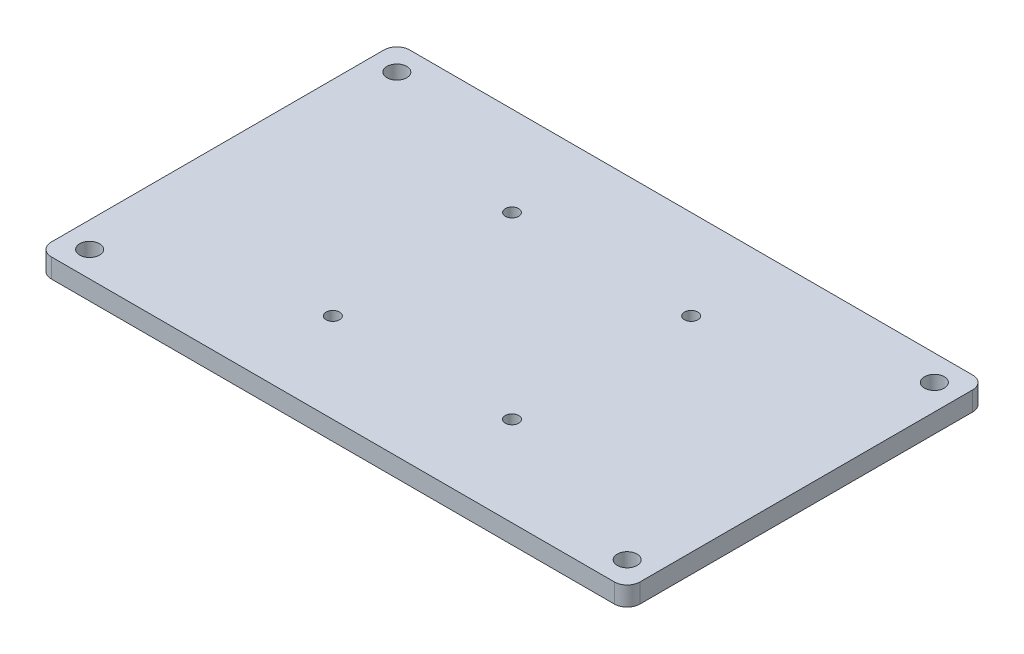
ISO-10303-21;
HEADER;
FILE_DESCRIPTION(('STEP AP214'),'2;1');
FILE_NAME('part.step','',(''),(''),'','','');
FILE_SCHEMA(('AUTOMOTIVE_DESIGN { 1 0 10303 214 1 1 1 1 }'));
ENDSEC;
DATA;
#1=APPLICATION_CONTEXT('core data for automotive mechanical design processes');
#2=APPLICATION_PROTOCOL_DEFINITION('international standard','automotive_design',2000,#1);
#3=PRODUCT_CONTEXT('',#1,'mechanical');
#4=PRODUCT('Part','Part','',(#3));
#5=PRODUCT_RELATED_PRODUCT_CATEGORY('part','',(#4));
#6=PRODUCT_DEFINITION_FORMATION('','',#4);
#7=PRODUCT_DEFINITION_CONTEXT('part definition',#1,'design');
#8=PRODUCT_DEFINITION('design','',#6,#7);
#9=PRODUCT_DEFINITION_SHAPE('','',#8);
#10=(LENGTH_UNIT() NAMED_UNIT(*) SI_UNIT(.MILLI.,.METRE.));
#11=(NAMED_UNIT(*) PLANE_ANGLE_UNIT() SI_UNIT($,.RADIAN.));
#12=(NAMED_UNIT(*) SI_UNIT($,.STERADIAN.) SOLID_ANGLE_UNIT());
#13=UNCERTAINTY_MEASURE_WITH_UNIT(LENGTH_MEASURE(1.E-05),#10,'distance_accuracy_value','');
#14=(GEOMETRIC_REPRESENTATION_CONTEXT(3) GLOBAL_UNCERTAINTY_ASSIGNED_CONTEXT((#13)) GLOBAL_UNIT_ASSIGNED_CONTEXT((#10,
#11,#12)) REPRESENTATION_CONTEXT('',''));
#15=CARTESIAN_POINT('',(0.,0.,0.));
#16=DIRECTION('',(0.,0.,1.));
#17=DIRECTION('',(1.,0.,0.));
#18=AXIS2_PLACEMENT_3D('',#15,#16,#17);
#19=CARTESIAN_POINT('',(44.,3.,26.));
#20=DIRECTION('',(0.,1.,0.));
#21=DIRECTION('',(0.,0.,1.));
#22=AXIS2_PLACEMENT_3D('',#19,#20,#21);
#23=PLANE('',#22);
#24=CARTESIAN_POINT('',(-14.,3.,-14.));
#25=DIRECTION('',(0.,1.,0.));
#26=DIRECTION('',(0.,0.,-1.));
#27=AXIS2_PLACEMENT_3D('',#24,#25,#26);
#28=CIRCLE('',#27,1.05);
#29=CARTESIAN_POINT('',(-14.,3.,-15.05));
#30=VERTEX_POINT('',#29);
#31=EDGE_CURVE('E253',#30,#30,#28,.T.);
#32=ORIENTED_EDGE('',*,*,#31,.F.);
#33=EDGE_LOOP('',(#32));
#34=FACE_BOUND('',#33,.T.);
#35=CARTESIAN_POINT('',(14.,3.,-14.));
#36=DIRECTION('',(0.,1.,0.));
#37=DIRECTION('',(0.,0.,1.));
#38=AXIS2_PLACEMENT_3D('',#35,#36,#37);
#39=CIRCLE('',#38,1.05);
#40=CARTESIAN_POINT('',(14.,3.,-12.95));
#41=VERTEX_POINT('',#40);
#42=EDGE_CURVE('E237',#41,#41,#39,.T.);
#43=ORIENTED_EDGE('',*,*,#42,.F.);
#44=EDGE_LOOP('',(#43));
#45=FACE_BOUND('',#44,.T.);
#46=CARTESIAN_POINT('',(42.,3.,24.));
#47=DIRECTION('',(0.,1.,0.));
#48=DIRECTION('',(0.,0.,-1.));
#49=AXIS2_PLACEMENT_3D('',#46,#47,#48);
#50=CIRCLE('',#49,1.55);
#51=CARTESIAN_POINT('',(42.,3.,22.45));
#52=VERTEX_POINT('',#51);
#53=EDGE_CURVE('E221',#52,#52,#50,.T.);
#54=ORIENTED_EDGE('',*,*,#53,.F.);
#55=EDGE_LOOP('',(#54));
#56=FACE_BOUND('',#55,.T.);
#57=CARTESIAN_POINT('',(42.,3.,-24.));
#58=DIRECTION('',(0.,1.,0.));
#59=DIRECTION('',(0.,0.,1.));
#60=AXIS2_PLACEMENT_3D('',#57,#58,#59);
#61=CIRCLE('',#60,1.55);
#62=CARTESIAN_POINT('',(42.,3.,-22.45));
#63=VERTEX_POINT('',#62);
#64=EDGE_CURVE('E146',#63,#63,#61,.T.);
#65=ORIENTED_EDGE('',*,*,#64,.F.);
#66=EDGE_LOOP('',(#65));
#67=FACE_BOUND('',#66,.T.);
#68=CARTESIAN_POINT('',(44.,3.,26.));
#69=DIRECTION('',(0.,1.,0.));
#70=DIRECTION('',(0.,0.,1.));
#71=AXIS2_PLACEMENT_3D('',#68,#69,#70);
#72=CIRCLE('',#71,2.);
#73=CARTESIAN_POINT('',(44.,3.,28.));
#74=VERTEX_POINT('',#73);
#75=CARTESIAN_POINT('',(46.,3.,26.));
#76=VERTEX_POINT('',#75);
#77=EDGE_CURVE('E164',#74,#76,#72,.T.);
#78=ORIENTED_EDGE('',*,*,#77,.T.);
#79=DIRECTION('',(0.,0.,-1.));
#80=VECTOR('',#79,1.);
#81=CARTESIAN_POINT('',(46.,3.,-26.));
#82=LINE('',#81,#80);
#83=CARTESIAN_POINT('',(46.,3.,-26.));
#84=VERTEX_POINT('',#83);
#85=EDGE_CURVE('E100',#76,#84,#82,.T.);
#86=ORIENTED_EDGE('',*,*,#85,.T.);
#87=CARTESIAN_POINT('',(44.,3.,-26.));
#88=DIRECTION('',(0.,1.,0.));
#89=DIRECTION('',(0.,0.,-1.));
#90=AXIS2_PLACEMENT_3D('',#87,#88,#89);
#91=CIRCLE('',#90,2.);
#92=CARTESIAN_POINT('',(44.,3.,-28.));
#93=VERTEX_POINT('',#92);
#94=EDGE_CURVE('E185',#84,#93,#91,.T.);
#95=ORIENTED_EDGE('',*,*,#94,.T.);
#96=DIRECTION('',(-1.,0.,0.));
#97=VECTOR('',#96,1.);
#98=CARTESIAN_POINT('',(-44.,3.,-28.));
#99=LINE('',#98,#97);
#100=CARTESIAN_POINT('',(-44.,3.,-28.));
#101=VERTEX_POINT('',#100);
#102=EDGE_CURVE('E199',#93,#101,#99,.T.);
#103=ORIENTED_EDGE('',*,*,#102,.T.);
#104=CARTESIAN_POINT('',(-44.,3.,-26.));
#105=DIRECTION('',(0.,1.,0.));
#106=DIRECTION('',(0.,0.,1.));
#107=AXIS2_PLACEMENT_3D('',#104,#105,#106);
#108=CIRCLE('',#107,2.);
#109=CARTESIAN_POINT('',(-46.,3.,-26.));
#110=VERTEX_POINT('',#109);
#111=EDGE_CURVE('E119',#101,#110,#108,.T.);
#112=ORIENTED_EDGE('',*,*,#111,.T.);
#113=DIRECTION('',(0.,0.,1.));
#114=VECTOR('',#113,1.);
#115=CARTESIAN_POINT('',(-46.,3.,-26.));
#116=LINE('',#115,#114);
#117=CARTESIAN_POINT('',(-46.,3.,26.));
#118=VERTEX_POINT('',#117);
#119=EDGE_CURVE('E113',#110,#118,#116,.T.);
#120=ORIENTED_EDGE('',*,*,#119,.T.);
#121=CARTESIAN_POINT('',(-44.,3.,26.));
#122=DIRECTION('',(0.,1.,0.));
#123=DIRECTION('',(0.,0.,1.));
#124=AXIS2_PLACEMENT_3D('',#121,#122,#123);
#125=CIRCLE('',#124,2.);
#126=CARTESIAN_POINT('',(-44.,3.,28.));
#127=VERTEX_POINT('',#126);
#128=EDGE_CURVE('E117',#118,#127,#125,.T.);
#129=ORIENTED_EDGE('',*,*,#128,.T.);
#130=DIRECTION('',(1.,0.,0.));
#131=VECTOR('',#130,1.);
#132=CARTESIAN_POINT('',(-44.,3.,28.));
#133=LINE('',#132,#131);
#134=EDGE_CURVE('E57',#127,#74,#133,.T.);
#135=ORIENTED_EDGE('',*,*,#134,.T.);
#136=EDGE_LOOP('',(#78,#86,#95,#103,#112,#120,#129,#135));
#137=FACE_BOUND('',#136,.T.);
#138=CARTESIAN_POINT('',(-42.,3.,-24.));
#139=DIRECTION('',(0.,1.,0.));
#140=DIRECTION('',(0.,0.,-1.));
#141=AXIS2_PLACEMENT_3D('',#138,#139,#140);
#142=CIRCLE('',#141,1.55);
#143=CARTESIAN_POINT('',(-42.,3.,-25.55));
#144=VERTEX_POINT('',#143);
#145=EDGE_CURVE('E213',#144,#144,#142,.T.);
#146=ORIENTED_EDGE('',*,*,#145,.F.);
#147=EDGE_LOOP('',(#146));
#148=FACE_BOUND('',#147,.T.);
#149=CARTESIAN_POINT('',(-42.,3.,24.));
#150=DIRECTION('',(0.,1.,0.));
#151=DIRECTION('',(0.,0.,1.));
#152=AXIS2_PLACEMENT_3D('',#149,#150,#151);
#153=CIRCLE('',#152,1.55);
#154=CARTESIAN_POINT('',(-42.,3.,25.55));
#155=VERTEX_POINT('',#154);
#156=EDGE_CURVE('E229',#155,#155,#153,.T.);
#157=ORIENTED_EDGE('',*,*,#156,.F.);
#158=EDGE_LOOP('',(#157));
#159=FACE_BOUND('',#158,.T.);
#160=CARTESIAN_POINT('',(14.,3.,14.));
#161=DIRECTION('',(0.,1.,0.));
#162=DIRECTION('',(0.,0.,-1.));
#163=AXIS2_PLACEMENT_3D('',#160,#161,#162);
#164=CIRCLE('',#163,1.05);
#165=CARTESIAN_POINT('',(14.,3.,12.95));
#166=VERTEX_POINT('',#165);
#167=EDGE_CURVE('E245',#166,#166,#164,.T.);
#168=ORIENTED_EDGE('',*,*,#167,.F.);
#169=EDGE_LOOP('',(#168));
#170=FACE_BOUND('',#169,.T.);
#171=CARTESIAN_POINT('',(-14.,3.,14.));
#172=DIRECTION('',(0.,1.,0.));
#173=DIRECTION('',(0.,0.,1.));
#174=AXIS2_PLACEMENT_3D('',#171,#172,#173);
#175=CIRCLE('',#174,1.05);
#176=CARTESIAN_POINT('',(-14.,3.,15.05));
#177=VERTEX_POINT('',#176);
#178=EDGE_CURVE('E261',#177,#177,#175,.T.);
#179=ORIENTED_EDGE('',*,*,#178,.F.);
#180=EDGE_LOOP('',(#179));
#181=FACE_BOUND('',#180,.T.);
#182=ADVANCED_FACE('F39',(#34,#45,#56,#67,#137,#148,#159,#170,#181),#23,.T.);
#183=CARTESIAN_POINT('',(44.,0.,26.));
#184=DIRECTION('',(0.,1.,0.));
#185=DIRECTION('',(0.,0.,1.));
#186=AXIS2_PLACEMENT_3D('',#183,#184,#185);
#187=PLANE('',#186);
#188=CARTESIAN_POINT('',(44.,0.,26.));
#189=DIRECTION('',(0.,1.,0.));
#190=DIRECTION('',(0.,0.,1.));
#191=AXIS2_PLACEMENT_3D('',#188,#189,#190);
#192=CIRCLE('',#191,2.);
#193=CARTESIAN_POINT('',(44.,0.,28.));
#194=VERTEX_POINT('',#193);
#195=CARTESIAN_POINT('',(46.,0.,26.));
#196=VERTEX_POINT('',#195);
#197=EDGE_CURVE('E141',#194,#196,#192,.T.);
#198=ORIENTED_EDGE('',*,*,#197,.F.);
#199=DIRECTION('',(1.,0.,0.));
#200=VECTOR('',#199,1.);
#201=CARTESIAN_POINT('',(-44.,0.,28.));
#202=LINE('',#201,#200);
#203=CARTESIAN_POINT('',(-44.,0.,28.));
#204=VERTEX_POINT('',#203);
#205=EDGE_CURVE('E92',#204,#194,#202,.T.);
#206=ORIENTED_EDGE('',*,*,#205,.F.);
#207=CARTESIAN_POINT('',(-44.,0.,26.));
#208=DIRECTION('',(0.,1.,0.));
#209=DIRECTION('',(0.,0.,1.));
#210=AXIS2_PLACEMENT_3D('',#207,#208,#209);
#211=CIRCLE('',#210,2.);
#212=CARTESIAN_POINT('',(-46.,0.,26.));
#213=VERTEX_POINT('',#212);
#214=EDGE_CURVE('E86',#213,#204,#211,.T.);
#215=ORIENTED_EDGE('',*,*,#214,.F.);
#216=DIRECTION('',(0.,0.,1.));
#217=VECTOR('',#216,1.);
#218=CARTESIAN_POINT('',(-46.,0.,-26.));
#219=LINE('',#218,#217);
#220=CARTESIAN_POINT('',(-46.,0.,-26.));
#221=VERTEX_POINT('',#220);
#222=EDGE_CURVE('E128',#221,#213,#219,.T.);
#223=ORIENTED_EDGE('',*,*,#222,.F.);
#224=CARTESIAN_POINT('',(-44.,0.,-26.));
#225=DIRECTION('',(0.,1.,0.));
#226=DIRECTION('',(0.,0.,1.));
#227=AXIS2_PLACEMENT_3D('',#224,#225,#226);
#228=CIRCLE('',#227,2.);
#229=CARTESIAN_POINT('',(-44.,0.,-28.));
#230=VERTEX_POINT('',#229);
#231=EDGE_CURVE('E155',#230,#221,#228,.T.);
#232=ORIENTED_EDGE('',*,*,#231,.F.);
#233=DIRECTION('',(-1.,0.,0.));
#234=VECTOR('',#233,1.);
#235=CARTESIAN_POINT('',(-44.,0.,-28.));
#236=LINE('',#235,#234);
#237=CARTESIAN_POINT('',(44.,0.,-28.));
#238=VERTEX_POINT('',#237);
#239=EDGE_CURVE('E152',#238,#230,#236,.T.);
#240=ORIENTED_EDGE('',*,*,#239,.F.);
#241=CARTESIAN_POINT('',(44.,0.,-26.));
#242=DIRECTION('',(0.,1.,0.));
#243=DIRECTION('',(0.,0.,-1.));
#244=AXIS2_PLACEMENT_3D('',#241,#242,#243);
#245=CIRCLE('',#244,2.);
#246=CARTESIAN_POINT('',(46.,0.,-26.));
#247=VERTEX_POINT('',#246);
#248=EDGE_CURVE('E149',#247,#238,#245,.T.);
#249=ORIENTED_EDGE('',*,*,#248,.F.);
#250=DIRECTION('',(0.,0.,-1.));
#251=VECTOR('',#250,1.);
#252=CARTESIAN_POINT('',(46.,0.,-26.));
#253=LINE('',#252,#251);
#254=EDGE_CURVE('E145',#196,#247,#253,.T.);
#255=ORIENTED_EDGE('',*,*,#254,.F.);
#256=EDGE_LOOP('',(#198,#206,#215,#223,#232,#240,#249,#255));
#257=FACE_BOUND('',#256,.T.);
#258=CARTESIAN_POINT('',(42.,0.,-24.));
#259=DIRECTION('',(0.,1.,0.));
#260=DIRECTION('',(0.,0.,1.));
#261=AXIS2_PLACEMENT_3D('',#258,#259,#260);
#262=CIRCLE('',#261,1.55);
#263=CARTESIAN_POINT('',(42.,0.,-22.45));
#264=VERTEX_POINT('',#263);
#265=EDGE_CURVE('E209',#264,#264,#262,.T.);
#266=ORIENTED_EDGE('',*,*,#265,.T.);
#267=EDGE_LOOP('',(#266));
#268=FACE_BOUND('',#267,.T.);
#269=CARTESIAN_POINT('',(-42.,0.,-24.));
#270=DIRECTION('',(0.,1.,0.));
#271=DIRECTION('',(0.,0.,-1.));
#272=AXIS2_PLACEMENT_3D('',#269,#270,#271);
#273=CIRCLE('',#272,1.55);
#274=CARTESIAN_POINT('',(-42.,0.,-25.55));
#275=VERTEX_POINT('',#274);
#276=EDGE_CURVE('E217',#275,#275,#273,.T.);
#277=ORIENTED_EDGE('',*,*,#276,.T.);
#278=EDGE_LOOP('',(#277));
#279=FACE_BOUND('',#278,.T.);
#280=CARTESIAN_POINT('',(42.,0.,24.));
#281=DIRECTION('',(0.,1.,0.));
#282=DIRECTION('',(0.,0.,-1.));
#283=AXIS2_PLACEMENT_3D('',#280,#281,#282);
#284=CIRCLE('',#283,1.55);
#285=CARTESIAN_POINT('',(42.,0.,22.45));
#286=VERTEX_POINT('',#285);
#287=EDGE_CURVE('E225',#286,#286,#284,.T.);
#288=ORIENTED_EDGE('',*,*,#287,.T.);
#289=EDGE_LOOP('',(#288));
#290=FACE_BOUND('',#289,.T.);
#291=CARTESIAN_POINT('',(-42.,0.,24.));
#292=DIRECTION('',(0.,1.,0.));
#293=DIRECTION('',(0.,0.,1.));
#294=AXIS2_PLACEMENT_3D('',#291,#292,#293);
#295=CIRCLE('',#294,1.55);
#296=CARTESIAN_POINT('',(-42.,0.,25.55));
#297=VERTEX_POINT('',#296);
#298=EDGE_CURVE('E233',#297,#297,#295,.T.);
#299=ORIENTED_EDGE('',*,*,#298,.T.);
#300=EDGE_LOOP('',(#299));
#301=FACE_BOUND('',#300,.T.);
#302=CARTESIAN_POINT('',(14.,0.,-14.));
#303=DIRECTION('',(0.,1.,0.));
#304=DIRECTION('',(0.,0.,1.));
#305=AXIS2_PLACEMENT_3D('',#302,#303,#304);
#306=CIRCLE('',#305,1.05);
#307=CARTESIAN_POINT('',(14.,0.,-12.95));
#308=VERTEX_POINT('',#307);
#309=EDGE_CURVE('E241',#308,#308,#306,.T.);
#310=ORIENTED_EDGE('',*,*,#309,.T.);
#311=EDGE_LOOP('',(#310));
#312=FACE_BOUND('',#311,.T.);
#313=CARTESIAN_POINT('',(14.,0.,14.));
#314=DIRECTION('',(0.,1.,0.));
#315=DIRECTION('',(0.,0.,-1.));
#316=AXIS2_PLACEMENT_3D('',#313,#314,#315);
#317=CIRCLE('',#316,1.05);
#318=CARTESIAN_POINT('',(14.,0.,12.95));
#319=VERTEX_POINT('',#318);
#320=EDGE_CURVE('E249',#319,#319,#317,.T.);
#321=ORIENTED_EDGE('',*,*,#320,.T.);
#322=EDGE_LOOP('',(#321));
#323=FACE_BOUND('',#322,.T.);
#324=CARTESIAN_POINT('',(-14.,0.,-14.));
#325=DIRECTION('',(0.,1.,0.));
#326=DIRECTION('',(0.,0.,-1.));
#327=AXIS2_PLACEMENT_3D('',#324,#325,#326);
#328=CIRCLE('',#327,1.05);
#329=CARTESIAN_POINT('',(-14.,0.,-15.05));
#330=VERTEX_POINT('',#329);
#331=EDGE_CURVE('E257',#330,#330,#328,.T.);
#332=ORIENTED_EDGE('',*,*,#331,.T.);
#333=EDGE_LOOP('',(#332));
#334=FACE_BOUND('',#333,.T.);
#335=CARTESIAN_POINT('',(-14.,0.,14.));
#336=DIRECTION('',(0.,1.,0.));
#337=DIRECTION('',(0.,0.,1.));
#338=AXIS2_PLACEMENT_3D('',#335,#336,#337);
#339=CIRCLE('',#338,1.05);
#340=CARTESIAN_POINT('',(-14.,0.,15.05));
#341=VERTEX_POINT('',#340);
#342=EDGE_CURVE('E265',#341,#341,#339,.T.);
#343=ORIENTED_EDGE('',*,*,#342,.T.);
#344=EDGE_LOOP('',(#343));
#345=FACE_BOUND('',#344,.T.);
#346=ADVANCED_FACE('F189',(#257,#268,#279,#290,#301,#312,#323,#334,#345),#187,.F.);
#347=CARTESIAN_POINT('',(44.,3.,26.));
#348=DIRECTION('',(0.,-1.,0.));
#349=DIRECTION('',(0.,0.,-1.));
#350=AXIS2_PLACEMENT_3D('',#347,#348,#349);
#351=CYLINDRICAL_SURFACE('',#350,2.);
#352=ORIENTED_EDGE('',*,*,#197,.T.);
#353=DIRECTION('',(0.,-1.,0.));
#354=VECTOR('',#353,1.);
#355=CARTESIAN_POINT('',(46.,3.,26.));
#356=LINE('',#355,#354);
#357=EDGE_CURVE('E11',#76,#196,#356,.T.);
#358=ORIENTED_EDGE('',*,*,#357,.F.);
#359=ORIENTED_EDGE('',*,*,#77,.F.);
#360=DIRECTION('',(0.,-1.,0.));
#361=VECTOR('',#360,1.);
#362=CARTESIAN_POINT('',(44.,3.,28.));
#363=LINE('',#362,#361);
#364=EDGE_CURVE('E137',#74,#194,#363,.T.);
#365=ORIENTED_EDGE('',*,*,#364,.T.);
#366=EDGE_LOOP('',(#352,#358,#359,#365));
#367=FACE_BOUND('',#366,.T.);
#368=ADVANCED_FACE('F41',(#367),#351,.T.);
#369=CARTESIAN_POINT('',(46.,3.,-26.));
#370=DIRECTION('',(-1.,0.,0.));
#371=DIRECTION('',(0.,0.,1.));
#372=AXIS2_PLACEMENT_3D('',#369,#370,#371);
#373=PLANE('',#372);
#374=ORIENTED_EDGE('',*,*,#254,.T.);
#375=DIRECTION('',(0.,-1.,0.));
#376=VECTOR('',#375,1.);
#377=CARTESIAN_POINT('',(46.,3.,-26.));
#378=LINE('',#377,#376);
#379=EDGE_CURVE('E49',#84,#247,#378,.T.);
#380=ORIENTED_EDGE('',*,*,#379,.F.);
#381=ORIENTED_EDGE('',*,*,#85,.F.);
#382=ORIENTED_EDGE('',*,*,#357,.T.);
#383=EDGE_LOOP('',(#374,#380,#381,#382));
#384=FACE_BOUND('',#383,.T.);
#385=ADVANCED_FACE('F301',(#384),#373,.F.);
#386=CARTESIAN_POINT('',(44.,3.,-26.));
#387=DIRECTION('',(0.,-1.,0.));
#388=DIRECTION('',(0.,0.,-1.));
#389=AXIS2_PLACEMENT_3D('',#386,#387,#388);
#390=CYLINDRICAL_SURFACE('',#389,2.);
#391=ORIENTED_EDGE('',*,*,#248,.T.);
#392=DIRECTION('',(0.,-1.,0.));
#393=VECTOR('',#392,1.);
#394=CARTESIAN_POINT('',(44.,3.,-28.));
#395=LINE('',#394,#393);
#396=EDGE_CURVE('E175',#93,#238,#395,.T.);
#397=ORIENTED_EDGE('',*,*,#396,.F.);
#398=ORIENTED_EDGE('',*,*,#94,.F.);
#399=ORIENTED_EDGE('',*,*,#379,.T.);
#400=EDGE_LOOP('',(#391,#397,#398,#399));
#401=FACE_BOUND('',#400,.T.);
#402=ADVANCED_FACE('F183',(#401),#390,.T.);
#403=CARTESIAN_POINT('',(-44.,3.,-28.));
#404=DIRECTION('',(0.,0.,1.));
#405=DIRECTION('',(1.,0.,0.));
#406=AXIS2_PLACEMENT_3D('',#403,#404,#405);
#407=PLANE('',#406);
#408=ORIENTED_EDGE('',*,*,#239,.T.);
#409=DIRECTION('',(0.,-1.,0.));
#410=VECTOR('',#409,1.);
#411=CARTESIAN_POINT('',(-44.,3.,-28.));
#412=LINE('',#411,#410);
#413=EDGE_CURVE('E171',#101,#230,#412,.T.);
#414=ORIENTED_EDGE('',*,*,#413,.F.);
#415=ORIENTED_EDGE('',*,*,#102,.F.);
#416=ORIENTED_EDGE('',*,*,#396,.T.);
#417=EDGE_LOOP('',(#408,#414,#415,#416));
#418=FACE_BOUND('',#417,.T.);
#419=ADVANCED_FACE('F194',(#418),#407,.F.);
#420=CARTESIAN_POINT('',(-44.,3.,-26.));
#421=DIRECTION('',(0.,-1.,0.));
#422=DIRECTION('',(0.,0.,-1.));
#423=AXIS2_PLACEMENT_3D('',#420,#421,#422);
#424=CYLINDRICAL_SURFACE('',#423,2.);
#425=ORIENTED_EDGE('',*,*,#231,.T.);
#426=DIRECTION('',(0.,-1.,0.));
#427=VECTOR('',#426,1.);
#428=CARTESIAN_POINT('',(-46.,3.,-26.));
#429=LINE('',#428,#427);
#430=EDGE_CURVE('E130',#110,#221,#429,.T.);
#431=ORIENTED_EDGE('',*,*,#430,.F.);
#432=ORIENTED_EDGE('',*,*,#111,.F.);
#433=ORIENTED_EDGE('',*,*,#413,.T.);
#434=EDGE_LOOP('',(#425,#431,#432,#433));
#435=FACE_BOUND('',#434,.T.);
#436=ADVANCED_FACE('F197',(#435),#424,.T.);
#437=CARTESIAN_POINT('',(-46.,3.,-26.));
#438=DIRECTION('',(1.,0.,0.));
#439=DIRECTION('',(0.,0.,-1.));
#440=AXIS2_PLACEMENT_3D('',#437,#438,#439);
#441=PLANE('',#440);
#442=ORIENTED_EDGE('',*,*,#222,.T.);
#443=DIRECTION('',(0.,-1.,0.));
#444=VECTOR('',#443,1.);
#445=CARTESIAN_POINT('',(-46.,3.,26.));
#446=LINE('',#445,#444);
#447=EDGE_CURVE('E125',#118,#213,#446,.T.);
#448=ORIENTED_EDGE('',*,*,#447,.F.);
#449=ORIENTED_EDGE('',*,*,#119,.F.);
#450=ORIENTED_EDGE('',*,*,#430,.T.);
#451=EDGE_LOOP('',(#442,#448,#449,#450));
#452=FACE_BOUND('',#451,.T.);
#453=ADVANCED_FACE('F126',(#452),#441,.F.);
#454=CARTESIAN_POINT('',(-44.,3.,26.));
#455=DIRECTION('',(0.,-1.,0.));
#456=DIRECTION('',(0.,0.,-1.));
#457=AXIS2_PLACEMENT_3D('',#454,#455,#456);
#458=CYLINDRICAL_SURFACE('',#457,2.);
#459=ORIENTED_EDGE('',*,*,#214,.T.);
#460=DIRECTION('',(0.,-1.,0.));
#461=VECTOR('',#460,1.);
#462=CARTESIAN_POINT('',(-44.,3.,28.));
#463=LINE('',#462,#461);
#464=EDGE_CURVE('E131',#127,#204,#463,.T.);
#465=ORIENTED_EDGE('',*,*,#464,.F.);
#466=ORIENTED_EDGE('',*,*,#128,.F.);
#467=ORIENTED_EDGE('',*,*,#447,.T.);
#468=EDGE_LOOP('',(#459,#465,#466,#467));
#469=FACE_BOUND('',#468,.T.);
#470=ADVANCED_FACE('F133',(#469),#458,.T.);
#471=CARTESIAN_POINT('',(-44.,3.,28.));
#472=DIRECTION('',(0.,0.,-1.));
#473=DIRECTION('',(-1.,0.,0.));
#474=AXIS2_PLACEMENT_3D('',#471,#472,#473);
#475=PLANE('',#474);
#476=ORIENTED_EDGE('',*,*,#205,.T.);
#477=ORIENTED_EDGE('',*,*,#364,.F.);
#478=ORIENTED_EDGE('',*,*,#134,.F.);
#479=ORIENTED_EDGE('',*,*,#464,.T.);
#480=EDGE_LOOP('',(#476,#477,#478,#479));
#481=FACE_BOUND('',#480,.T.);
#482=ADVANCED_FACE('F289',(#481),#475,.F.);
#483=CARTESIAN_POINT('',(42.,3.,-24.));
#484=DIRECTION('',(0.,-1.,0.));
#485=DIRECTION('',(0.,0.,-1.));
#486=AXIS2_PLACEMENT_3D('',#483,#484,#485);
#487=CYLINDRICAL_SURFACE('',#486,1.55);
#488=ORIENTED_EDGE('',*,*,#64,.T.);
#489=EDGE_LOOP('',(#488));
#490=FACE_BOUND('',#489,.T.);
#491=ORIENTED_EDGE('',*,*,#265,.F.);
#492=EDGE_LOOP('',(#491));
#493=FACE_BOUND('',#492,.T.);
#494=ADVANCED_FACE('F286',(#490,#493),#487,.F.);
#495=CARTESIAN_POINT('',(-42.,3.,-24.));
#496=DIRECTION('',(0.,-1.,0.));
#497=DIRECTION('',(0.,0.,-1.));
#498=AXIS2_PLACEMENT_3D('',#495,#496,#497);
#499=CYLINDRICAL_SURFACE('',#498,1.55);
#500=ORIENTED_EDGE('',*,*,#145,.T.);
#501=EDGE_LOOP('',(#500));
#502=FACE_BOUND('',#501,.T.);
#503=ORIENTED_EDGE('',*,*,#276,.F.);
#504=EDGE_LOOP('',(#503));
#505=FACE_BOUND('',#504,.T.);
#506=ADVANCED_FACE('F365',(#502,#505),#499,.F.);
#507=CARTESIAN_POINT('',(42.,3.,24.));
#508=DIRECTION('',(0.,-1.,0.));
#509=DIRECTION('',(0.,0.,-1.));
#510=AXIS2_PLACEMENT_3D('',#507,#508,#509);
#511=CYLINDRICAL_SURFACE('',#510,1.55);
#512=ORIENTED_EDGE('',*,*,#53,.T.);
#513=EDGE_LOOP('',(#512));
#514=FACE_BOUND('',#513,.T.);
#515=ORIENTED_EDGE('',*,*,#287,.F.);
#516=EDGE_LOOP('',(#515));
#517=FACE_BOUND('',#516,.T.);
#518=ADVANCED_FACE('F373',(#514,#517),#511,.F.);
#519=CARTESIAN_POINT('',(-42.,3.,24.));
#520=DIRECTION('',(0.,-1.,0.));
#521=DIRECTION('',(0.,0.,-1.));
#522=AXIS2_PLACEMENT_3D('',#519,#520,#521);
#523=CYLINDRICAL_SURFACE('',#522,1.55);
#524=ORIENTED_EDGE('',*,*,#156,.T.);
#525=EDGE_LOOP('',(#524));
#526=FACE_BOUND('',#525,.T.);
#527=ORIENTED_EDGE('',*,*,#298,.F.);
#528=EDGE_LOOP('',(#527));
#529=FACE_BOUND('',#528,.T.);
#530=ADVANCED_FACE('F381',(#526,#529),#523,.F.);
#531=CARTESIAN_POINT('',(14.,3.,-14.));
#532=DIRECTION('',(0.,-1.,0.));
#533=DIRECTION('',(0.,0.,-1.));
#534=AXIS2_PLACEMENT_3D('',#531,#532,#533);
#535=CYLINDRICAL_SURFACE('',#534,1.05);
#536=ORIENTED_EDGE('',*,*,#42,.T.);
#537=EDGE_LOOP('',(#536));
#538=FACE_BOUND('',#537,.T.);
#539=ORIENTED_EDGE('',*,*,#309,.F.);
#540=EDGE_LOOP('',(#539));
#541=FACE_BOUND('',#540,.T.);
#542=ADVANCED_FACE('F390',(#538,#541),#535,.F.);
#543=CARTESIAN_POINT('',(14.,3.,14.));
#544=DIRECTION('',(0.,-1.,0.));
#545=DIRECTION('',(0.,0.,-1.));
#546=AXIS2_PLACEMENT_3D('',#543,#544,#545);
#547=CYLINDRICAL_SURFACE('',#546,1.05);
#548=ORIENTED_EDGE('',*,*,#167,.T.);
#549=EDGE_LOOP('',(#548));
#550=FACE_BOUND('',#549,.T.);
#551=ORIENTED_EDGE('',*,*,#320,.F.);
#552=EDGE_LOOP('',(#551));
#553=FACE_BOUND('',#552,.T.);
#554=ADVANCED_FACE('F399',(#550,#553),#547,.F.);
#555=CARTESIAN_POINT('',(-14.,3.,-14.));
#556=DIRECTION('',(0.,-1.,0.));
#557=DIRECTION('',(0.,0.,-1.));
#558=AXIS2_PLACEMENT_3D('',#555,#556,#557);
#559=CYLINDRICAL_SURFACE('',#558,1.05);
#560=ORIENTED_EDGE('',*,*,#31,.T.);
#561=EDGE_LOOP('',(#560));
#562=FACE_BOUND('',#561,.T.);
#563=ORIENTED_EDGE('',*,*,#331,.F.);
#564=EDGE_LOOP('',(#563));
#565=FACE_BOUND('',#564,.T.);
#566=ADVANCED_FACE('F408',(#562,#565),#559,.F.);
#567=CARTESIAN_POINT('',(-14.,3.,14.));
#568=DIRECTION('',(0.,-1.,0.));
#569=DIRECTION('',(0.,0.,-1.));
#570=AXIS2_PLACEMENT_3D('',#567,#568,#569);
#571=CYLINDRICAL_SURFACE('',#570,1.05);
#572=ORIENTED_EDGE('',*,*,#178,.T.);
#573=EDGE_LOOP('',(#572));
#574=FACE_BOUND('',#573,.T.);
#575=ORIENTED_EDGE('',*,*,#342,.F.);
#576=EDGE_LOOP('',(#575));
#577=FACE_BOUND('',#576,.T.);
#578=ADVANCED_FACE('F273',(#574,#577),#571,.F.);
#579=CLOSED_SHELL('',(#182,#346,#368,#385,#402,#419,#436,#453,#470,#482,#494,#506,#518,#530,
#542,#554,#566,#578));
#580=MANIFOLD_SOLID_BREP('B2',#579);
#581=ADVANCED_BREP_SHAPE_REPRESENTATION('',(#18,#580),#14);
#582=SHAPE_DEFINITION_REPRESENTATION(#9,#581);
ENDSEC;
END-ISO-10303-21;
